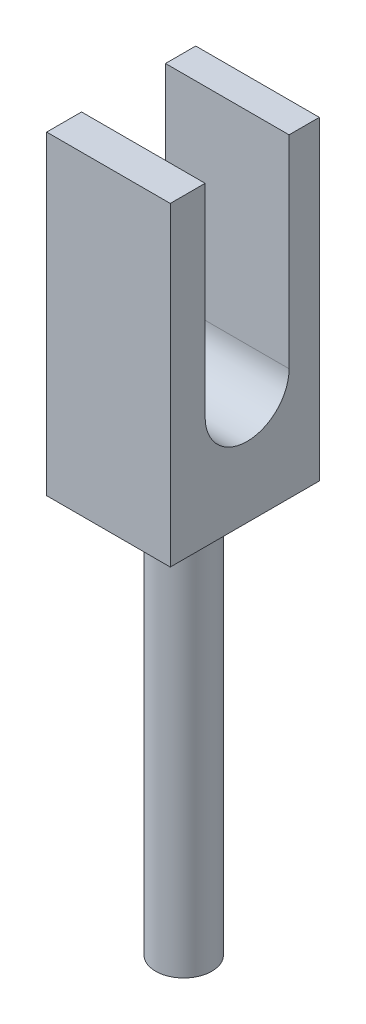
ISO-10303-21;
HEADER;
FILE_DESCRIPTION(('STEP AP214'),'2;1');
FILE_NAME('part.step','',(''),(''),'','','');
FILE_SCHEMA(('AUTOMOTIVE_DESIGN { 1 0 10303 214 1 1 1 1 }'));
ENDSEC;
DATA;
#1=APPLICATION_CONTEXT('core data for automotive mechanical design processes');
#2=APPLICATION_PROTOCOL_DEFINITION('international standard','automotive_design',2000,#1);
#3=PRODUCT_CONTEXT('',#1,'mechanical');
#4=PRODUCT('Part','Part','',(#3));
#5=PRODUCT_RELATED_PRODUCT_CATEGORY('part','',(#4));
#6=PRODUCT_DEFINITION_FORMATION('','',#4);
#7=PRODUCT_DEFINITION_CONTEXT('part definition',#1,'design');
#8=PRODUCT_DEFINITION('design','',#6,#7);
#9=PRODUCT_DEFINITION_SHAPE('','',#8);
#10=(LENGTH_UNIT() NAMED_UNIT(*) SI_UNIT(.MILLI.,.METRE.));
#11=(NAMED_UNIT(*) PLANE_ANGLE_UNIT() SI_UNIT($,.RADIAN.));
#12=(NAMED_UNIT(*) SI_UNIT($,.STERADIAN.) SOLID_ANGLE_UNIT());
#13=UNCERTAINTY_MEASURE_WITH_UNIT(LENGTH_MEASURE(1.E-05),#10,'distance_accuracy_value','');
#14=(GEOMETRIC_REPRESENTATION_CONTEXT(3) GLOBAL_UNCERTAINTY_ASSIGNED_CONTEXT((#13)) GLOBAL_UNIT_ASSIGNED_CONTEXT((#10,
#11,#12)) REPRESENTATION_CONTEXT('',''));
#15=CARTESIAN_POINT('',(0.,0.,0.));
#16=DIRECTION('',(0.,0.,1.));
#17=DIRECTION('',(1.,0.,0.));
#18=AXIS2_PLACEMENT_3D('',#15,#16,#17);
#19=CARTESIAN_POINT('',(61.976,0.,0.));
#20=DIRECTION('',(0.,1.,0.));
#21=DIRECTION('',(0.,0.,1.));
#22=AXIS2_PLACEMENT_3D('',#19,#20,#21);
#23=PLANE('',#22);
#24=DIRECTION('',(0.,0.,-1.));
#25=VECTOR('',#24,1.);
#26=CARTESIAN_POINT('',(0.,0.,0.));
#27=LINE('',#26,#25);
#28=CARTESIAN_POINT('',(0.,0.,0.));
#29=VERTEX_POINT('',#28);
#30=CARTESIAN_POINT('',(0.,0.,-74.7572504991172));
#31=VERTEX_POINT('',#30);
#32=EDGE_CURVE('E69',#29,#31,#27,.T.);
#33=ORIENTED_EDGE('',*,*,#32,.T.);
#34=DIRECTION('',(-1.,0.,0.));
#35=VECTOR('',#34,1.);
#36=CARTESIAN_POINT('',(61.976,0.,-74.7572504991172));
#37=LINE('',#36,#35);
#38=CARTESIAN_POINT('',(61.976,0.,-74.7572504991172));
#39=VERTEX_POINT('',#38);
#40=EDGE_CURVE('E72',#39,#31,#37,.T.);
#41=ORIENTED_EDGE('',*,*,#40,.F.);
#42=DIRECTION('',(0.,0.,-1.));
#43=VECTOR('',#42,1.);
#44=CARTESIAN_POINT('',(61.976,0.,0.));
#45=LINE('',#44,#43);
#46=CARTESIAN_POINT('',(61.976,0.,0.));
#47=VERTEX_POINT('',#46);
#48=EDGE_CURVE('E57',#47,#39,#45,.T.);
#49=ORIENTED_EDGE('',*,*,#48,.F.);
#50=DIRECTION('',(-1.,0.,0.));
#51=VECTOR('',#50,1.);
#52=CARTESIAN_POINT('',(61.976,0.,0.));
#53=LINE('',#52,#51);
#54=EDGE_CURVE('E75',#47,#29,#53,.T.);
#55=ORIENTED_EDGE('',*,*,#54,.T.);
#56=EDGE_LOOP('',(#33,#41,#49,#55));
#57=FACE_BOUND('',#56,.T.);
#58=CARTESIAN_POINT('',(30.6913880596092,0.,-38.0460021154375));
#59=DIRECTION('',(0.,1.,0.));
#60=DIRECTION('',(0.,0.,1.));
#61=AXIS2_PLACEMENT_3D('',#58,#59,#60);
#62=CIRCLE('',#61,14.0914086472127);
#63=CARTESIAN_POINT('',(30.6913880596092,0.,-23.9545934682247));
#64=VERTEX_POINT('',#63);
#65=EDGE_CURVE('E11',#64,#64,#62,.F.);
#66=ORIENTED_EDGE('',*,*,#65,.F.);
#67=EDGE_LOOP('',(#66));
#68=FACE_BOUND('',#67,.T.);
#69=ADVANCED_FACE('F33',(#57,#68),#23,.F.);
#70=CARTESIAN_POINT('',(61.976,0.,0.));
#71=DIRECTION('',(0.,0.,-1.));
#72=DIRECTION('',(-1.,0.,0.));
#73=AXIS2_PLACEMENT_3D('',#70,#71,#72);
#74=PLANE('',#73);
#75=DIRECTION('',(0.,-1.,0.));
#76=VECTOR('',#75,1.);
#77=CARTESIAN_POINT('',(0.,0.,0.));
#78=LINE('',#77,#76);
#79=CARTESIAN_POINT('',(0.,157.940774554992,0.));
#80=VERTEX_POINT('',#79);
#81=EDGE_CURVE('E81',#80,#29,#78,.T.);
#82=ORIENTED_EDGE('',*,*,#81,.T.);
#83=ORIENTED_EDGE('',*,*,#54,.F.);
#84=DIRECTION('',(0.,-1.,0.));
#85=VECTOR('',#84,1.);
#86=CARTESIAN_POINT('',(61.976,0.,0.));
#87=LINE('',#86,#85);
#88=CARTESIAN_POINT('',(61.976,157.940774554992,0.));
#89=VERTEX_POINT('',#88);
#90=EDGE_CURVE('E96',#89,#47,#87,.T.);
#91=ORIENTED_EDGE('',*,*,#90,.F.);
#92=DIRECTION('',(1.,0.,0.));
#93=VECTOR('',#92,1.);
#94=CARTESIAN_POINT('',(61.976,157.940774554992,0.));
#95=LINE('',#94,#93);
#96=EDGE_CURVE('E125',#80,#89,#95,.T.);
#97=ORIENTED_EDGE('',*,*,#96,.F.);
#98=EDGE_LOOP('',(#82,#83,#91,#97));
#99=FACE_BOUND('',#98,.T.);
#100=ADVANCED_FACE('F35',(#99),#74,.F.);
#101=CARTESIAN_POINT('',(61.976,0.,-74.7572504991172));
#102=DIRECTION('',(0.,0.,1.));
#103=DIRECTION('',(1.,0.,0.));
#104=AXIS2_PLACEMENT_3D('',#101,#102,#103);
#105=PLANE('',#104);
#106=DIRECTION('',(0.,1.,0.));
#107=VECTOR('',#106,1.);
#108=CARTESIAN_POINT('',(0.,0.,-74.7572504991172));
#109=LINE('',#108,#107);
#110=CARTESIAN_POINT('',(0.,157.940774554992,-74.7572504991172));
#111=VERTEX_POINT('',#110);
#112=EDGE_CURVE('E80',#31,#111,#109,.T.);
#113=ORIENTED_EDGE('',*,*,#112,.T.);
#114=DIRECTION('',(-1.,0.,0.));
#115=VECTOR('',#114,1.);
#116=CARTESIAN_POINT('',(0.,157.940774554992,-74.7572504991172));
#117=LINE('',#116,#115);
#118=CARTESIAN_POINT('',(61.976,157.940774554992,-74.7572504991172));
#119=VERTEX_POINT('',#118);
#120=EDGE_CURVE('E159',#119,#111,#117,.T.);
#121=ORIENTED_EDGE('',*,*,#120,.F.);
#122=DIRECTION('',(0.,1.,0.));
#123=VECTOR('',#122,1.);
#124=CARTESIAN_POINT('',(61.976,0.,-74.7572504991172));
#125=LINE('',#124,#123);
#126=EDGE_CURVE('E89',#39,#119,#125,.T.);
#127=ORIENTED_EDGE('',*,*,#126,.F.);
#128=ORIENTED_EDGE('',*,*,#40,.T.);
#129=EDGE_LOOP('',(#113,#121,#127,#128));
#130=FACE_BOUND('',#129,.T.);
#131=ADVANCED_FACE('F85',(#130),#105,.F.);
#132=CARTESIAN_POINT('',(61.976,0.,0.));
#133=DIRECTION('',(-1.,0.,0.));
#134=DIRECTION('',(0.,0.,1.));
#135=AXIS2_PLACEMENT_3D('',#132,#133,#134);
#136=PLANE('',#135);
#137=ORIENTED_EDGE('',*,*,#126,.T.);
#138=DIRECTION('',(0.,0.,-1.));
#139=VECTOR('',#138,1.);
#140=CARTESIAN_POINT('',(61.976,157.940774554992,-59.5853061593142));
#141=LINE('',#140,#139);
#142=CARTESIAN_POINT('',(61.976,157.940774554992,-59.5853061593142));
#143=VERTEX_POINT('',#142);
#144=EDGE_CURVE('E161',#143,#119,#141,.T.);
#145=ORIENTED_EDGE('',*,*,#144,.F.);
#146=DIRECTION('',(0.,-1.,0.));
#147=VECTOR('',#146,1.);
#148=CARTESIAN_POINT('',(61.976,157.940774554992,-59.5853061593142));
#149=LINE('',#148,#147);
#150=CARTESIAN_POINT('',(61.976,56.3407745549916,-59.5853061593142));
#151=VERTEX_POINT('',#150);
#152=EDGE_CURVE('E156',#143,#151,#149,.T.);
#153=ORIENTED_EDGE('',*,*,#152,.T.);
#154=CARTESIAN_POINT('',(61.976,56.3407745549916,-38.5337609937579));
#155=DIRECTION('',(1.,0.,0.));
#156=DIRECTION('',(0.,0.,-1.));
#157=AXIS2_PLACEMENT_3D('',#154,#155,#156);
#158=CIRCLE('',#157,21.0515451655563);
#159=CARTESIAN_POINT('',(61.976,56.3407745549916,-17.4822158282017));
#160=VERTEX_POINT('',#159);
#161=EDGE_CURVE('E121',#160,#151,#158,.T.);
#162=ORIENTED_EDGE('',*,*,#161,.F.);
#163=DIRECTION('',(0.,-1.,0.));
#164=VECTOR('',#163,1.);
#165=CARTESIAN_POINT('',(61.976,157.940774554992,-17.4822158282017));
#166=LINE('',#165,#164);
#167=CARTESIAN_POINT('',(61.976,157.940774554992,-17.4822158282017));
#168=VERTEX_POINT('',#167);
#169=EDGE_CURVE('E120',#168,#160,#166,.T.);
#170=ORIENTED_EDGE('',*,*,#169,.F.);
#171=DIRECTION('',(0.,0.,-1.));
#172=VECTOR('',#171,1.);
#173=CARTESIAN_POINT('',(61.976,157.940774554992,0.));
#174=LINE('',#173,#172);
#175=EDGE_CURVE('E147',#89,#168,#174,.T.);
#176=ORIENTED_EDGE('',*,*,#175,.F.);
#177=ORIENTED_EDGE('',*,*,#90,.T.);
#178=ORIENTED_EDGE('',*,*,#48,.T.);
#179=EDGE_LOOP('',(#137,#145,#153,#162,#170,#176,#177,#178));
#180=FACE_BOUND('',#179,.T.);
#181=ADVANCED_FACE('F180',(#180),#136,.F.);
#182=CARTESIAN_POINT('',(0.,0.,0.));
#183=DIRECTION('',(-1.,0.,0.));
#184=DIRECTION('',(0.,0.,1.));
#185=AXIS2_PLACEMENT_3D('',#182,#183,#184);
#186=PLANE('',#185);
#187=CARTESIAN_POINT('',(0.,56.3407745549916,-38.5337609937579));
#188=DIRECTION('',(-1.,0.,0.));
#189=DIRECTION('',(0.,0.,1.));
#190=AXIS2_PLACEMENT_3D('',#187,#188,#189);
#191=CIRCLE('',#190,21.0515451655563);
#192=CARTESIAN_POINT('',(0.,56.3407745549916,-59.5853061593142));
#193=VERTEX_POINT('',#192);
#194=CARTESIAN_POINT('',(0.,56.3407745549916,-17.4822158282017));
#195=VERTEX_POINT('',#194);
#196=EDGE_CURVE('E41',#193,#195,#191,.T.);
#197=ORIENTED_EDGE('',*,*,#196,.F.);
#198=DIRECTION('',(0.,-1.,0.));
#199=VECTOR('',#198,1.);
#200=CARTESIAN_POINT('',(0.,157.940774554992,-59.5853061593142));
#201=LINE('',#200,#199);
#202=CARTESIAN_POINT('',(0.,157.940774554992,-59.5853061593142));
#203=VERTEX_POINT('',#202);
#204=EDGE_CURVE('E154',#203,#193,#201,.T.);
#205=ORIENTED_EDGE('',*,*,#204,.F.);
#206=DIRECTION('',(0.,0.,1.));
#207=VECTOR('',#206,1.);
#208=CARTESIAN_POINT('',(0.,157.940774554992,-59.5853061593142));
#209=LINE('',#208,#207);
#210=EDGE_CURVE('E95',#111,#203,#209,.T.);
#211=ORIENTED_EDGE('',*,*,#210,.F.);
#212=ORIENTED_EDGE('',*,*,#112,.F.);
#213=ORIENTED_EDGE('',*,*,#32,.F.);
#214=ORIENTED_EDGE('',*,*,#81,.F.);
#215=DIRECTION('',(0.,0.,1.));
#216=VECTOR('',#215,1.);
#217=CARTESIAN_POINT('',(0.,157.940774554992,0.));
#218=LINE('',#217,#216);
#219=CARTESIAN_POINT('',(0.,157.940774554992,-17.4822158282017));
#220=VERTEX_POINT('',#219);
#221=EDGE_CURVE('E124',#220,#80,#218,.T.);
#222=ORIENTED_EDGE('',*,*,#221,.F.);
#223=DIRECTION('',(0.,-1.,0.));
#224=VECTOR('',#223,1.);
#225=CARTESIAN_POINT('',(0.,157.940774554992,-17.4822158282017));
#226=LINE('',#225,#224);
#227=EDGE_CURVE('E117',#220,#195,#226,.T.);
#228=ORIENTED_EDGE('',*,*,#227,.T.);
#229=EDGE_LOOP('',(#197,#205,#211,#212,#213,#214,#222,#228));
#230=FACE_BOUND('',#229,.T.);
#231=ADVANCED_FACE('F92',(#230),#186,.T.);
#232=CARTESIAN_POINT('',(0.,56.3407745549916,-38.5337609937579));
#233=DIRECTION('',(1.,0.,0.));
#234=DIRECTION('',(0.,0.,-1.));
#235=AXIS2_PLACEMENT_3D('',#232,#233,#234);
#236=CYLINDRICAL_SURFACE('',#235,21.0515451655563);
#237=ORIENTED_EDGE('',*,*,#196,.T.);
#238=DIRECTION('',(1.,0.,0.));
#239=VECTOR('',#238,1.);
#240=CARTESIAN_POINT('',(0.,56.3407745549916,-17.4822158282017));
#241=LINE('',#240,#239);
#242=EDGE_CURVE('E105',#160,#195,#241,.F.);
#243=ORIENTED_EDGE('',*,*,#242,.F.);
#244=ORIENTED_EDGE('',*,*,#161,.T.);
#245=DIRECTION('',(1.,0.,0.));
#246=VECTOR('',#245,1.);
#247=CARTESIAN_POINT('',(0.,56.3407745549916,-59.5853061593142));
#248=LINE('',#247,#246);
#249=EDGE_CURVE('E48',#193,#151,#248,.T.);
#250=ORIENTED_EDGE('',*,*,#249,.F.);
#251=EDGE_LOOP('',(#237,#243,#244,#250));
#252=FACE_BOUND('',#251,.T.);
#253=ADVANCED_FACE('F104',(#252),#236,.F.);
#254=CARTESIAN_POINT('',(61.976,157.940774554992,-17.4822158282017));
#255=DIRECTION('',(0.,0.,1.));
#256=DIRECTION('',(1.,0.,0.));
#257=AXIS2_PLACEMENT_3D('',#254,#255,#256);
#258=PLANE('',#257);
#259=ORIENTED_EDGE('',*,*,#242,.T.);
#260=ORIENTED_EDGE('',*,*,#227,.F.);
#261=DIRECTION('',(-1.,0.,0.));
#262=VECTOR('',#261,1.);
#263=CARTESIAN_POINT('',(61.976,157.940774554992,-17.4822158282017));
#264=LINE('',#263,#262);
#265=EDGE_CURVE('E146',#168,#220,#264,.T.);
#266=ORIENTED_EDGE('',*,*,#265,.F.);
#267=ORIENTED_EDGE('',*,*,#169,.T.);
#268=EDGE_LOOP('',(#259,#260,#266,#267));
#269=FACE_BOUND('',#268,.T.);
#270=ADVANCED_FACE('F114',(#269),#258,.F.);
#271=CARTESIAN_POINT('',(0.,157.940774554992,0.));
#272=DIRECTION('',(0.,1.,0.));
#273=DIRECTION('',(0.,0.,1.));
#274=AXIS2_PLACEMENT_3D('',#271,#272,#273);
#275=PLANE('',#274);
#276=ORIENTED_EDGE('',*,*,#175,.T.);
#277=ORIENTED_EDGE('',*,*,#265,.T.);
#278=ORIENTED_EDGE('',*,*,#221,.T.);
#279=ORIENTED_EDGE('',*,*,#96,.T.);
#280=EDGE_LOOP('',(#276,#277,#278,#279));
#281=FACE_BOUND('',#280,.T.);
#282=ADVANCED_FACE('F144',(#281),#275,.T.);
#283=CARTESIAN_POINT('',(30.6913880596092,-203.2,-38.0460021154375));
#284=DIRECTION('',(0.,1.,0.));
#285=DIRECTION('',(0.,0.,1.));
#286=AXIS2_PLACEMENT_3D('',#283,#284,#285);
#287=CYLINDRICAL_SURFACE('',#286,14.0914086472127);
#288=CARTESIAN_POINT('',(30.6913880596092,-203.2,-38.0460021154375));
#289=DIRECTION('',(0.,-1.,0.));
#290=DIRECTION('',(0.,0.,-1.));
#291=AXIS2_PLACEMENT_3D('',#288,#289,#290);
#292=CIRCLE('',#291,14.0914086472127);
#293=CARTESIAN_POINT('',(30.6913880596092,-203.2,-52.1374107626502));
#294=VERTEX_POINT('',#293);
#295=EDGE_CURVE('E151',#294,#294,#292,.T.);
#296=ORIENTED_EDGE('',*,*,#295,.F.);
#297=EDGE_LOOP('',(#296));
#298=FACE_BOUND('',#297,.T.);
#299=ORIENTED_EDGE('',*,*,#65,.T.);
#300=EDGE_LOOP('',(#299));
#301=FACE_BOUND('',#300,.T.);
#302=ADVANCED_FACE('F257',(#298,#301),#287,.T.);
#303=CARTESIAN_POINT('',(30.6913880596092,-203.2,-38.0460021154375));
#304=DIRECTION('',(0.,-1.,0.));
#305=DIRECTION('',(0.,0.,-1.));
#306=AXIS2_PLACEMENT_3D('',#303,#304,#305);
#307=PLANE('',#306);
#308=ORIENTED_EDGE('',*,*,#295,.T.);
#309=EDGE_LOOP('',(#308));
#310=FACE_BOUND('',#309,.T.);
#311=ADVANCED_FACE('F215',(#310),#307,.T.);
#312=CARTESIAN_POINT('',(0.,157.940774554992,-59.5853061593142));
#313=DIRECTION('',(0.,0.,-1.));
#314=DIRECTION('',(-1.,0.,0.));
#315=AXIS2_PLACEMENT_3D('',#312,#313,#314);
#316=PLANE('',#315);
#317=ORIENTED_EDGE('',*,*,#249,.T.);
#318=ORIENTED_EDGE('',*,*,#152,.F.);
#319=DIRECTION('',(1.,0.,0.));
#320=VECTOR('',#319,1.);
#321=CARTESIAN_POINT('',(0.,157.940774554992,-59.5853061593142));
#322=LINE('',#321,#320);
#323=EDGE_CURVE('E164',#203,#143,#322,.T.);
#324=ORIENTED_EDGE('',*,*,#323,.F.);
#325=ORIENTED_EDGE('',*,*,#204,.T.);
#326=EDGE_LOOP('',(#317,#318,#324,#325));
#327=FACE_BOUND('',#326,.T.);
#328=ADVANCED_FACE('F176',(#327),#316,.F.);
#329=CARTESIAN_POINT('',(0.,157.940774554992,0.));
#330=DIRECTION('',(0.,-1.,0.));
#331=DIRECTION('',(0.,0.,-1.));
#332=AXIS2_PLACEMENT_3D('',#329,#330,#331);
#333=PLANE('',#332);
#334=ORIENTED_EDGE('',*,*,#210,.T.);
#335=ORIENTED_EDGE('',*,*,#323,.T.);
#336=ORIENTED_EDGE('',*,*,#144,.T.);
#337=ORIENTED_EDGE('',*,*,#120,.T.);
#338=EDGE_LOOP('',(#334,#335,#336,#337));
#339=FACE_BOUND('',#338,.T.);
#340=ADVANCED_FACE('F169',(#339),#333,.F.);
#341=CLOSED_SHELL('',(#69,#100,#131,#181,#231,#253,#270,#282,#302,#311,#328,#340));
#342=MANIFOLD_SOLID_BREP('B2',#341);
#343=ADVANCED_BREP_SHAPE_REPRESENTATION('',(#18,#342),#14);
#344=SHAPE_DEFINITION_REPRESENTATION(#9,#343);
ENDSEC;
END-ISO-10303-21;
